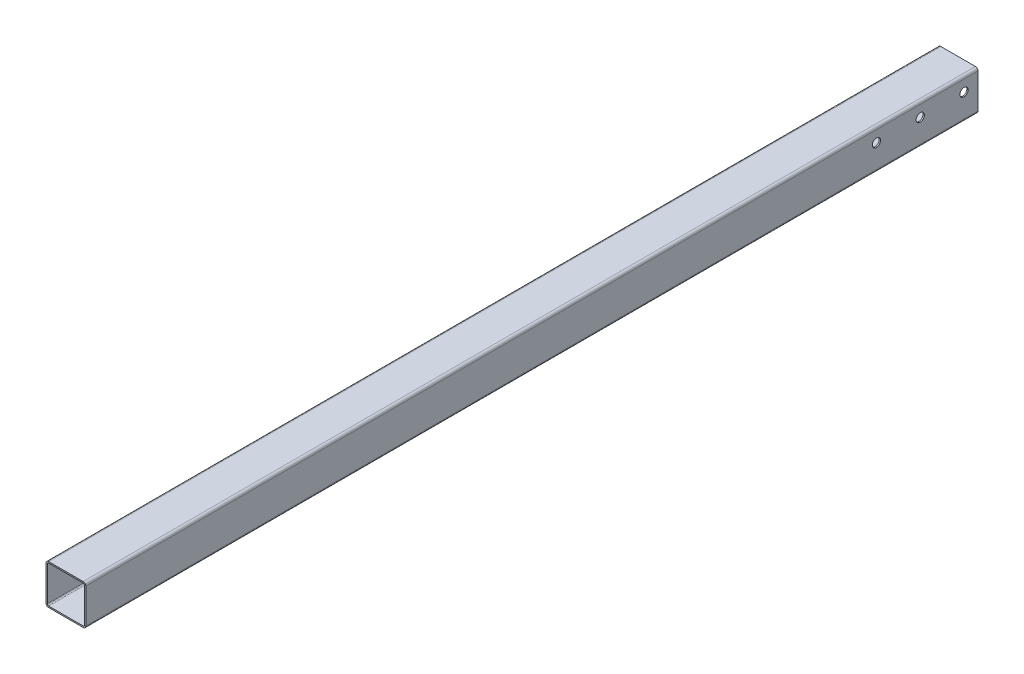
ISO-10303-21;
HEADER;
FILE_DESCRIPTION(('STEP AP214'),'2;1');
FILE_NAME('part.step','',(''),(''),'','','');
FILE_SCHEMA(('AUTOMOTIVE_DESIGN { 1 0 10303 214 1 1 1 1 }'));
ENDSEC;
DATA;
#1=APPLICATION_CONTEXT('core data for automotive mechanical design processes');
#2=APPLICATION_PROTOCOL_DEFINITION('international standard','automotive_design',2000,#1);
#3=PRODUCT_CONTEXT('',#1,'mechanical');
#4=PRODUCT('Part','Part','',(#3));
#5=PRODUCT_RELATED_PRODUCT_CATEGORY('part','',(#4));
#6=PRODUCT_DEFINITION_FORMATION('','',#4);
#7=PRODUCT_DEFINITION_CONTEXT('part definition',#1,'design');
#8=PRODUCT_DEFINITION('design','',#6,#7);
#9=PRODUCT_DEFINITION_SHAPE('','',#8);
#10=(LENGTH_UNIT() NAMED_UNIT(*) SI_UNIT(.MILLI.,.METRE.));
#11=(NAMED_UNIT(*) PLANE_ANGLE_UNIT() SI_UNIT($,.RADIAN.));
#12=(NAMED_UNIT(*) SI_UNIT($,.STERADIAN.) SOLID_ANGLE_UNIT());
#13=UNCERTAINTY_MEASURE_WITH_UNIT(LENGTH_MEASURE(1.E-05),#10,'distance_accuracy_value','');
#14=(GEOMETRIC_REPRESENTATION_CONTEXT(3) GLOBAL_UNCERTAINTY_ASSIGNED_CONTEXT((#13)) GLOBAL_UNIT_ASSIGNED_CONTEXT((#10,
#11,#12)) REPRESENTATION_CONTEXT('',''));
#15=CARTESIAN_POINT('',(0.,0.,0.));
#16=DIRECTION('',(0.,0.,1.));
#17=DIRECTION('',(1.,0.,0.));
#18=AXIS2_PLACEMENT_3D('',#15,#16,#17);
#19=CARTESIAN_POINT('',(-27.5336,-27.5336,1422.4));
#20=DIRECTION('',(0.,0.,-1.));
#21=DIRECTION('',(-1.,0.,0.));
#22=AXIS2_PLACEMENT_3D('',#19,#20,#21);
#23=PLANE('',#22);
#24=CARTESIAN_POINT('',(-27.5336,-27.5336,1422.4));
#25=DIRECTION('',(0.,0.,1.));
#26=DIRECTION('',(-1.,0.,0.));
#27=AXIS2_PLACEMENT_3D('',#24,#25,#26);
#28=CIRCLE('',#27,4.21639999999999);
#29=CARTESIAN_POINT('',(-31.75,-27.5336,1422.4));
#30=VERTEX_POINT('',#29);
#31=CARTESIAN_POINT('',(-27.5336,-31.75,1422.4));
#32=VERTEX_POINT('',#31);
#33=EDGE_CURVE('E229',#30,#32,#28,.T.);
#34=ORIENTED_EDGE('',*,*,#33,.T.);
#35=DIRECTION('',(1.,0.,0.));
#36=VECTOR('',#35,1.);
#37=CARTESIAN_POINT('',(27.5336,-31.75,1422.4));
#38=LINE('',#37,#36);
#39=CARTESIAN_POINT('',(27.5336,-31.75,1422.4));
#40=VERTEX_POINT('',#39);
#41=EDGE_CURVE('E232',#32,#40,#38,.T.);
#42=ORIENTED_EDGE('',*,*,#41,.T.);
#43=CARTESIAN_POINT('',(27.5336,-27.5336,1422.4));
#44=DIRECTION('',(0.,0.,1.));
#45=DIRECTION('',(-1.,0.,0.));
#46=AXIS2_PLACEMENT_3D('',#43,#44,#45);
#47=CIRCLE('',#46,4.21639999999999);
#48=CARTESIAN_POINT('',(31.75,-27.5336,1422.4));
#49=VERTEX_POINT('',#48);
#50=EDGE_CURVE('E235',#40,#49,#47,.T.);
#51=ORIENTED_EDGE('',*,*,#50,.T.);
#52=DIRECTION('',(0.,1.,0.));
#53=VECTOR('',#52,1.);
#54=CARTESIAN_POINT('',(31.75,27.5336,1422.4));
#55=LINE('',#54,#53);
#56=CARTESIAN_POINT('',(31.75,27.5336,1422.4));
#57=VERTEX_POINT('',#56);
#58=EDGE_CURVE('E237',#49,#57,#55,.T.);
#59=ORIENTED_EDGE('',*,*,#58,.T.);
#60=CARTESIAN_POINT('',(27.5336,27.5336,1422.4));
#61=DIRECTION('',(0.,0.,1.));
#62=DIRECTION('',(-1.,0.,0.));
#63=AXIS2_PLACEMENT_3D('',#60,#61,#62);
#64=CIRCLE('',#63,4.2164);
#65=CARTESIAN_POINT('',(27.5336,31.75,1422.4));
#66=VERTEX_POINT('',#65);
#67=EDGE_CURVE('E239',#57,#66,#64,.T.);
#68=ORIENTED_EDGE('',*,*,#67,.T.);
#69=DIRECTION('',(-1.,0.,0.));
#70=VECTOR('',#69,1.);
#71=CARTESIAN_POINT('',(27.5336,31.75,1422.4));
#72=LINE('',#71,#70);
#73=CARTESIAN_POINT('',(-27.5336,31.75,1422.4));
#74=VERTEX_POINT('',#73);
#75=EDGE_CURVE('E241',#66,#74,#72,.T.);
#76=ORIENTED_EDGE('',*,*,#75,.T.);
#77=CARTESIAN_POINT('',(-27.5336,27.5336,1422.4));
#78=DIRECTION('',(0.,0.,1.));
#79=DIRECTION('',(1.,0.,0.));
#80=AXIS2_PLACEMENT_3D('',#77,#78,#79);
#81=CIRCLE('',#80,4.2164);
#82=CARTESIAN_POINT('',(-31.75,27.5336,1422.4));
#83=VERTEX_POINT('',#82);
#84=EDGE_CURVE('E243',#74,#83,#81,.T.);
#85=ORIENTED_EDGE('',*,*,#84,.T.);
#86=DIRECTION('',(0.,-1.,0.));
#87=VECTOR('',#86,1.);
#88=CARTESIAN_POINT('',(-31.75,27.5336,1422.4));
#89=LINE('',#88,#87);
#90=EDGE_CURVE('E245',#83,#30,#89,.T.);
#91=ORIENTED_EDGE('',*,*,#90,.T.);
#92=EDGE_LOOP('',(#34,#42,#51,#59,#68,#76,#85,#91));
#93=FACE_BOUND('',#92,.T.);
#94=CARTESIAN_POINT('',(-27.5336,-27.5336,1422.4));
#95=DIRECTION('',(0.,0.,1.));
#96=DIRECTION('',(-1.,0.,0.));
#97=AXIS2_PLACEMENT_3D('',#94,#95,#96);
#98=CIRCLE('',#97,2.1082);
#99=CARTESIAN_POINT('',(-29.6418,-27.5336,1422.4));
#100=VERTEX_POINT('',#99);
#101=CARTESIAN_POINT('',(-27.5336,-29.6418,1422.4));
#102=VERTEX_POINT('',#101);
#103=EDGE_CURVE('E162',#100,#102,#98,.T.);
#104=ORIENTED_EDGE('',*,*,#103,.F.);
#105=DIRECTION('',(0.,-1.,0.));
#106=VECTOR('',#105,1.);
#107=CARTESIAN_POINT('',(-29.6418,27.5336,1422.4));
#108=LINE('',#107,#106);
#109=CARTESIAN_POINT('',(-29.6418,27.5336,1422.4));
#110=VERTEX_POINT('',#109);
#111=EDGE_CURVE('E196',#110,#100,#108,.T.);
#112=ORIENTED_EDGE('',*,*,#111,.F.);
#113=CARTESIAN_POINT('',(-27.5336,27.5336,1422.4));
#114=DIRECTION('',(0.,0.,1.));
#115=DIRECTION('',(1.,0.,0.));
#116=AXIS2_PLACEMENT_3D('',#113,#114,#115);
#117=CIRCLE('',#116,2.1082);
#118=CARTESIAN_POINT('',(-27.5336,29.6418,1422.4));
#119=VERTEX_POINT('',#118);
#120=EDGE_CURVE('E194',#119,#110,#117,.T.);
#121=ORIENTED_EDGE('',*,*,#120,.F.);
#122=DIRECTION('',(-1.,0.,0.));
#123=VECTOR('',#122,1.);
#124=CARTESIAN_POINT('',(27.5336,29.6418,1422.4));
#125=LINE('',#124,#123);
#126=CARTESIAN_POINT('',(27.5336,29.6418,1422.4));
#127=VERTEX_POINT('',#126);
#128=EDGE_CURVE('E192',#127,#119,#125,.T.);
#129=ORIENTED_EDGE('',*,*,#128,.F.);
#130=CARTESIAN_POINT('',(27.5336,27.5336,1422.4));
#131=DIRECTION('',(0.,0.,1.));
#132=DIRECTION('',(-1.,0.,0.));
#133=AXIS2_PLACEMENT_3D('',#130,#131,#132);
#134=CIRCLE('',#133,2.1082);
#135=CARTESIAN_POINT('',(29.6418,27.5336,1422.4));
#136=VERTEX_POINT('',#135);
#137=EDGE_CURVE('E190',#136,#127,#134,.T.);
#138=ORIENTED_EDGE('',*,*,#137,.F.);
#139=DIRECTION('',(0.,1.,0.));
#140=VECTOR('',#139,1.);
#141=CARTESIAN_POINT('',(29.6418,27.5336,1422.4));
#142=LINE('',#141,#140);
#143=CARTESIAN_POINT('',(29.6418,-27.5336,1422.4));
#144=VERTEX_POINT('',#143);
#145=EDGE_CURVE('E185',#144,#136,#142,.T.);
#146=ORIENTED_EDGE('',*,*,#145,.F.);
#147=CARTESIAN_POINT('',(27.5336,-27.5336,1422.4));
#148=DIRECTION('',(0.,0.,1.));
#149=DIRECTION('',(-1.,0.,0.));
#150=AXIS2_PLACEMENT_3D('',#147,#148,#149);
#151=CIRCLE('',#150,2.1082);
#152=CARTESIAN_POINT('',(27.5336,-29.6418,1422.4));
#153=VERTEX_POINT('',#152);
#154=EDGE_CURVE('E183',#153,#144,#151,.T.);
#155=ORIENTED_EDGE('',*,*,#154,.F.);
#156=DIRECTION('',(1.,0.,0.));
#157=VECTOR('',#156,1.);
#158=CARTESIAN_POINT('',(27.5336,-29.6418,1422.4));
#159=LINE('',#158,#157);
#160=EDGE_CURVE('E170',#102,#153,#159,.T.);
#161=ORIENTED_EDGE('',*,*,#160,.F.);
#162=EDGE_LOOP('',(#104,#112,#121,#129,#138,#146,#155,#161));
#163=FACE_BOUND('',#162,.T.);
#164=ADVANCED_FACE('F47',(#93,#163),#23,.F.);
#165=CARTESIAN_POINT('',(-27.5336,-27.5336,0.));
#166=DIRECTION('',(0.,0.,-1.));
#167=DIRECTION('',(-1.,0.,0.));
#168=AXIS2_PLACEMENT_3D('',#165,#166,#167);
#169=PLANE('',#168);
#170=CARTESIAN_POINT('',(-27.5336,-27.5336,0.));
#171=DIRECTION('',(0.,0.,1.));
#172=DIRECTION('',(-1.,0.,0.));
#173=AXIS2_PLACEMENT_3D('',#170,#171,#172);
#174=CIRCLE('',#173,4.21639999999999);
#175=CARTESIAN_POINT('',(-31.75,-27.5336,0.));
#176=VERTEX_POINT('',#175);
#177=CARTESIAN_POINT('',(-27.5336,-31.75,0.));
#178=VERTEX_POINT('',#177);
#179=EDGE_CURVE('E178',#176,#178,#174,.T.);
#180=ORIENTED_EDGE('',*,*,#179,.F.);
#181=DIRECTION('',(0.,-1.,0.));
#182=VECTOR('',#181,1.);
#183=CARTESIAN_POINT('',(-31.75,27.5336,0.));
#184=LINE('',#183,#182);
#185=CARTESIAN_POINT('',(-31.75,27.5336,0.));
#186=VERTEX_POINT('',#185);
#187=EDGE_CURVE('E233',#186,#176,#184,.T.);
#188=ORIENTED_EDGE('',*,*,#187,.F.);
#189=CARTESIAN_POINT('',(-27.5336,27.5336,0.));
#190=DIRECTION('',(0.,0.,1.));
#191=DIRECTION('',(1.,0.,0.));
#192=AXIS2_PLACEMENT_3D('',#189,#190,#191);
#193=CIRCLE('',#192,4.2164);
#194=CARTESIAN_POINT('',(-27.5336,31.75,0.));
#195=VERTEX_POINT('',#194);
#196=EDGE_CURVE('E260',#195,#186,#193,.T.);
#197=ORIENTED_EDGE('',*,*,#196,.F.);
#198=DIRECTION('',(-1.,0.,0.));
#199=VECTOR('',#198,1.);
#200=CARTESIAN_POINT('',(27.5336,31.75,0.));
#201=LINE('',#200,#199);
#202=CARTESIAN_POINT('',(27.5336,31.75,0.));
#203=VERTEX_POINT('',#202);
#204=EDGE_CURVE('E258',#203,#195,#201,.T.);
#205=ORIENTED_EDGE('',*,*,#204,.F.);
#206=CARTESIAN_POINT('',(27.5336,27.5336,0.));
#207=DIRECTION('',(0.,0.,1.));
#208=DIRECTION('',(-1.,0.,0.));
#209=AXIS2_PLACEMENT_3D('',#206,#207,#208);
#210=CIRCLE('',#209,4.2164);
#211=CARTESIAN_POINT('',(31.75,27.5336,0.));
#212=VERTEX_POINT('',#211);
#213=EDGE_CURVE('E256',#212,#203,#210,.T.);
#214=ORIENTED_EDGE('',*,*,#213,.F.);
#215=DIRECTION('',(0.,1.,0.));
#216=VECTOR('',#215,1.);
#217=CARTESIAN_POINT('',(31.75,27.5336,0.));
#218=LINE('',#217,#216);
#219=CARTESIAN_POINT('',(31.75,-27.5336,0.));
#220=VERTEX_POINT('',#219);
#221=EDGE_CURVE('E254',#220,#212,#218,.T.);
#222=ORIENTED_EDGE('',*,*,#221,.F.);
#223=CARTESIAN_POINT('',(27.5336,-27.5336,0.));
#224=DIRECTION('',(0.,0.,1.));
#225=DIRECTION('',(-1.,0.,0.));
#226=AXIS2_PLACEMENT_3D('',#223,#224,#225);
#227=CIRCLE('',#226,4.21639999999999);
#228=CARTESIAN_POINT('',(27.5336,-31.75,0.));
#229=VERTEX_POINT('',#228);
#230=EDGE_CURVE('E252',#229,#220,#227,.T.);
#231=ORIENTED_EDGE('',*,*,#230,.F.);
#232=DIRECTION('',(1.,0.,0.));
#233=VECTOR('',#232,1.);
#234=CARTESIAN_POINT('',(27.5336,-31.75,0.));
#235=LINE('',#234,#233);
#236=EDGE_CURVE('E250',#178,#229,#235,.T.);
#237=ORIENTED_EDGE('',*,*,#236,.F.);
#238=EDGE_LOOP('',(#180,#188,#197,#205,#214,#222,#231,#237));
#239=FACE_BOUND('',#238,.T.);
#240=DIRECTION('',(0.,-1.,0.));
#241=VECTOR('',#240,1.);
#242=CARTESIAN_POINT('',(-29.6418,27.5336,0.));
#243=LINE('',#242,#241);
#244=CARTESIAN_POINT('',(-29.6418,27.5336,0.));
#245=VERTEX_POINT('',#244);
#246=CARTESIAN_POINT('',(-29.6418,-27.5336,0.));
#247=VERTEX_POINT('',#246);
#248=EDGE_CURVE('E171',#245,#247,#243,.T.);
#249=ORIENTED_EDGE('',*,*,#248,.T.);
#250=CARTESIAN_POINT('',(-27.5336,-27.5336,0.));
#251=DIRECTION('',(0.,0.,1.));
#252=DIRECTION('',(-1.,0.,0.));
#253=AXIS2_PLACEMENT_3D('',#250,#251,#252);
#254=CIRCLE('',#253,2.1082);
#255=CARTESIAN_POINT('',(-27.5336,-29.6418,0.));
#256=VERTEX_POINT('',#255);
#257=EDGE_CURVE('E72',#247,#256,#254,.T.);
#258=ORIENTED_EDGE('',*,*,#257,.T.);
#259=DIRECTION('',(1.,0.,0.));
#260=VECTOR('',#259,1.);
#261=CARTESIAN_POINT('',(27.5336,-29.6418,0.));
#262=LINE('',#261,#260);
#263=CARTESIAN_POINT('',(27.5336,-29.6418,0.));
#264=VERTEX_POINT('',#263);
#265=EDGE_CURVE('E177',#256,#264,#262,.T.);
#266=ORIENTED_EDGE('',*,*,#265,.T.);
#267=CARTESIAN_POINT('',(27.5336,-27.5336,0.));
#268=DIRECTION('',(0.,0.,1.));
#269=DIRECTION('',(-1.,0.,0.));
#270=AXIS2_PLACEMENT_3D('',#267,#268,#269);
#271=CIRCLE('',#270,2.1082);
#272=CARTESIAN_POINT('',(29.6418,-27.5336,0.));
#273=VERTEX_POINT('',#272);
#274=EDGE_CURVE('E201',#264,#273,#271,.T.);
#275=ORIENTED_EDGE('',*,*,#274,.T.);
#276=DIRECTION('',(0.,1.,0.));
#277=VECTOR('',#276,1.);
#278=CARTESIAN_POINT('',(29.6418,27.5336,0.));
#279=LINE('',#278,#277);
#280=CARTESIAN_POINT('',(29.6418,27.5336,0.));
#281=VERTEX_POINT('',#280);
#282=EDGE_CURVE('E204',#273,#281,#279,.T.);
#283=ORIENTED_EDGE('',*,*,#282,.T.);
#284=CARTESIAN_POINT('',(27.5336,27.5336,0.));
#285=DIRECTION('',(0.,0.,1.));
#286=DIRECTION('',(-1.,0.,0.));
#287=AXIS2_PLACEMENT_3D('',#284,#285,#286);
#288=CIRCLE('',#287,2.1082);
#289=CARTESIAN_POINT('',(27.5336,29.6418,0.));
#290=VERTEX_POINT('',#289);
#291=EDGE_CURVE('E207',#281,#290,#288,.T.);
#292=ORIENTED_EDGE('',*,*,#291,.T.);
#293=DIRECTION('',(-1.,0.,0.));
#294=VECTOR('',#293,1.);
#295=CARTESIAN_POINT('',(27.5336,29.6418,0.));
#296=LINE('',#295,#294);
#297=CARTESIAN_POINT('',(-27.5336,29.6418,0.));
#298=VERTEX_POINT('',#297);
#299=EDGE_CURVE('E210',#290,#298,#296,.T.);
#300=ORIENTED_EDGE('',*,*,#299,.T.);
#301=CARTESIAN_POINT('',(-27.5336,27.5336,0.));
#302=DIRECTION('',(0.,0.,1.));
#303=DIRECTION('',(1.,0.,0.));
#304=AXIS2_PLACEMENT_3D('',#301,#302,#303);
#305=CIRCLE('',#304,2.1082);
#306=EDGE_CURVE('E213',#298,#245,#305,.T.);
#307=ORIENTED_EDGE('',*,*,#306,.T.);
#308=EDGE_LOOP('',(#249,#258,#266,#275,#283,#292,#300,#307));
#309=FACE_BOUND('',#308,.T.);
#310=ADVANCED_FACE('F326',(#239,#309),#169,.T.);
#311=CARTESIAN_POINT('',(-27.5336,-27.5336,1422.4));
#312=DIRECTION('',(0.,0.,-1.));
#313=DIRECTION('',(-1.,0.,0.));
#314=AXIS2_PLACEMENT_3D('',#311,#312,#313);
#315=CYLINDRICAL_SURFACE('',#314,4.21639999999999);
#316=ORIENTED_EDGE('',*,*,#179,.T.);
#317=DIRECTION('',(0.,0.,-1.));
#318=VECTOR('',#317,1.);
#319=CARTESIAN_POINT('',(-27.5336,-31.75,1422.4));
#320=LINE('',#319,#318);
#321=EDGE_CURVE('E11',#32,#178,#320,.T.);
#322=ORIENTED_EDGE('',*,*,#321,.F.);
#323=ORIENTED_EDGE('',*,*,#33,.F.);
#324=DIRECTION('',(0.,0.,-1.));
#325=VECTOR('',#324,1.);
#326=CARTESIAN_POINT('',(-31.75,-27.5336,1422.4));
#327=LINE('',#326,#325);
#328=EDGE_CURVE('E247',#30,#176,#327,.T.);
#329=ORIENTED_EDGE('',*,*,#328,.T.);
#330=EDGE_LOOP('',(#316,#322,#323,#329));
#331=FACE_BOUND('',#330,.T.);
#332=ADVANCED_FACE('F49',(#331),#315,.T.);
#333=CARTESIAN_POINT('',(27.5336,-31.75,1422.4));
#334=DIRECTION('',(0.,1.,0.));
#335=DIRECTION('',(0.,0.,1.));
#336=AXIS2_PLACEMENT_3D('',#333,#334,#335);
#337=PLANE('',#336);
#338=ORIENTED_EDGE('',*,*,#236,.T.);
#339=DIRECTION('',(0.,0.,-1.));
#340=VECTOR('',#339,1.);
#341=CARTESIAN_POINT('',(27.5336,-31.75,1422.4));
#342=LINE('',#341,#340);
#343=EDGE_CURVE('E56',#40,#229,#342,.T.);
#344=ORIENTED_EDGE('',*,*,#343,.F.);
#345=ORIENTED_EDGE('',*,*,#41,.F.);
#346=ORIENTED_EDGE('',*,*,#321,.T.);
#347=EDGE_LOOP('',(#338,#344,#345,#346));
#348=FACE_BOUND('',#347,.T.);
#349=ADVANCED_FACE('F366',(#348),#337,.F.);
#350=CARTESIAN_POINT('',(27.5336,-27.5336,1422.4));
#351=DIRECTION('',(0.,0.,-1.));
#352=DIRECTION('',(-1.,0.,0.));
#353=AXIS2_PLACEMENT_3D('',#350,#351,#352);
#354=CYLINDRICAL_SURFACE('',#353,4.21639999999999);
#355=ORIENTED_EDGE('',*,*,#230,.T.);
#356=DIRECTION('',(0.,0.,-1.));
#357=VECTOR('',#356,1.);
#358=CARTESIAN_POINT('',(31.75,-27.5336,1422.4));
#359=LINE('',#358,#357);
#360=EDGE_CURVE('E277',#49,#220,#359,.T.);
#361=ORIENTED_EDGE('',*,*,#360,.F.);
#362=ORIENTED_EDGE('',*,*,#50,.F.);
#363=ORIENTED_EDGE('',*,*,#343,.T.);
#364=EDGE_LOOP('',(#355,#361,#362,#363));
#365=FACE_BOUND('',#364,.T.);
#366=ADVANCED_FACE('F363',(#365),#354,.T.);
#367=CARTESIAN_POINT('',(31.75,27.5336,1422.4));
#368=DIRECTION('',(-1.,0.,0.));
#369=DIRECTION('',(0.,0.,1.));
#370=AXIS2_PLACEMENT_3D('',#367,#368,#369);
#371=PLANE('',#370);
#372=CARTESIAN_POINT('',(31.75,9.52499999999999,22.225));
#373=DIRECTION('',(1.,0.,0.));
#374=DIRECTION('',(0.,0.,-1.));
#375=AXIS2_PLACEMENT_3D('',#372,#373,#374);
#376=CIRCLE('',#375,6.54811999999999);
#377=CARTESIAN_POINT('',(31.75,9.52499999999999,15.67688));
#378=VERTEX_POINT('',#377);
#379=EDGE_CURVE('E620',#378,#378,#376,.T.);
#380=ORIENTED_EDGE('',*,*,#379,.F.);
#381=EDGE_LOOP('',(#380));
#382=FACE_BOUND('',#381,.T.);
#383=CARTESIAN_POINT('',(31.75,9.525,92.075));
#384=DIRECTION('',(1.,0.,0.));
#385=DIRECTION('',(0.,0.,-1.));
#386=AXIS2_PLACEMENT_3D('',#383,#384,#385);
#387=CIRCLE('',#386,6.54811999999999);
#388=CARTESIAN_POINT('',(31.75,9.525,85.52688));
#389=VERTEX_POINT('',#388);
#390=EDGE_CURVE('E295',#389,#389,#387,.T.);
#391=ORIENTED_EDGE('',*,*,#390,.F.);
#392=EDGE_LOOP('',(#391));
#393=FACE_BOUND('',#392,.T.);
#394=CARTESIAN_POINT('',(31.75,9.525,161.925));
#395=DIRECTION('',(1.,0.,0.));
#396=DIRECTION('',(0.,0.,-1.));
#397=AXIS2_PLACEMENT_3D('',#394,#395,#396);
#398=CIRCLE('',#397,6.54811999999999);
#399=CARTESIAN_POINT('',(31.75,9.525,155.37688));
#400=VERTEX_POINT('',#399);
#401=EDGE_CURVE('E292',#400,#400,#398,.T.);
#402=ORIENTED_EDGE('',*,*,#401,.F.);
#403=EDGE_LOOP('',(#402));
#404=FACE_BOUND('',#403,.T.);
#405=ORIENTED_EDGE('',*,*,#221,.T.);
#406=DIRECTION('',(0.,0.,-1.));
#407=VECTOR('',#406,1.);
#408=CARTESIAN_POINT('',(31.75,27.5336,1422.4));
#409=LINE('',#408,#407);
#410=EDGE_CURVE('E274',#57,#212,#409,.T.);
#411=ORIENTED_EDGE('',*,*,#410,.F.);
#412=ORIENTED_EDGE('',*,*,#58,.F.);
#413=ORIENTED_EDGE('',*,*,#360,.T.);
#414=EDGE_LOOP('',(#405,#411,#412,#413));
#415=FACE_BOUND('',#414,.T.);
#416=ADVANCED_FACE('F359',(#382,#393,#404,#415),#371,.F.);
#417=CARTESIAN_POINT('',(27.5336,27.5336,1422.4));
#418=DIRECTION('',(0.,0.,-1.));
#419=DIRECTION('',(-1.,0.,0.));
#420=AXIS2_PLACEMENT_3D('',#417,#418,#419);
#421=CYLINDRICAL_SURFACE('',#420,4.2164);
#422=ORIENTED_EDGE('',*,*,#213,.T.);
#423=DIRECTION('',(0.,0.,-1.));
#424=VECTOR('',#423,1.);
#425=CARTESIAN_POINT('',(27.5336,31.75,1422.4));
#426=LINE('',#425,#424);
#427=EDGE_CURVE('E271',#66,#203,#426,.T.);
#428=ORIENTED_EDGE('',*,*,#427,.F.);
#429=ORIENTED_EDGE('',*,*,#67,.F.);
#430=ORIENTED_EDGE('',*,*,#410,.T.);
#431=EDGE_LOOP('',(#422,#428,#429,#430));
#432=FACE_BOUND('',#431,.T.);
#433=ADVANCED_FACE('F355',(#432),#421,.T.);
#434=CARTESIAN_POINT('',(27.5336,31.75,1422.4));
#435=DIRECTION('',(0.,-1.,0.));
#436=DIRECTION('',(0.,0.,-1.));
#437=AXIS2_PLACEMENT_3D('',#434,#435,#436);
#438=PLANE('',#437);
#439=ORIENTED_EDGE('',*,*,#204,.T.);
#440=DIRECTION('',(0.,0.,-1.));
#441=VECTOR('',#440,1.);
#442=CARTESIAN_POINT('',(-27.5336,31.75,1422.4));
#443=LINE('',#442,#441);
#444=EDGE_CURVE('E268',#74,#195,#443,.T.);
#445=ORIENTED_EDGE('',*,*,#444,.F.);
#446=ORIENTED_EDGE('',*,*,#75,.F.);
#447=ORIENTED_EDGE('',*,*,#427,.T.);
#448=EDGE_LOOP('',(#439,#445,#446,#447));
#449=FACE_BOUND('',#448,.T.);
#450=ADVANCED_FACE('F351',(#449),#438,.F.);
#451=CARTESIAN_POINT('',(-27.5336,27.5336,1422.4));
#452=DIRECTION('',(0.,0.,-1.));
#453=DIRECTION('',(-1.,0.,0.));
#454=AXIS2_PLACEMENT_3D('',#451,#452,#453);
#455=CYLINDRICAL_SURFACE('',#454,4.2164);
#456=ORIENTED_EDGE('',*,*,#196,.T.);
#457=DIRECTION('',(0.,0.,-1.));
#458=VECTOR('',#457,1.);
#459=CARTESIAN_POINT('',(-31.75,27.5336,1422.4));
#460=LINE('',#459,#458);
#461=EDGE_CURVE('E265',#83,#186,#460,.T.);
#462=ORIENTED_EDGE('',*,*,#461,.F.);
#463=ORIENTED_EDGE('',*,*,#84,.F.);
#464=ORIENTED_EDGE('',*,*,#444,.T.);
#465=EDGE_LOOP('',(#456,#462,#463,#464));
#466=FACE_BOUND('',#465,.T.);
#467=ADVANCED_FACE('F347',(#466),#455,.T.);
#468=CARTESIAN_POINT('',(-31.75,27.5336,1422.4));
#469=DIRECTION('',(1.,0.,0.));
#470=DIRECTION('',(0.,1.,0.));
#471=AXIS2_PLACEMENT_3D('',#468,#469,#470);
#472=PLANE('',#471);
#473=CARTESIAN_POINT('',(-31.75,9.52499999999999,22.225));
#474=DIRECTION('',(1.,0.,0.));
#475=DIRECTION('',(0.,0.,-1.));
#476=AXIS2_PLACEMENT_3D('',#473,#474,#475);
#477=CIRCLE('',#476,6.54811999999998);
#478=CARTESIAN_POINT('',(-31.75,9.52499999999999,15.67688));
#479=VERTEX_POINT('',#478);
#480=EDGE_CURVE('E621',#479,#479,#477,.T.);
#481=ORIENTED_EDGE('',*,*,#480,.T.);
#482=EDGE_LOOP('',(#481));
#483=FACE_BOUND('',#482,.T.);
#484=CARTESIAN_POINT('',(-31.75,9.525,92.075));
#485=DIRECTION('',(1.,0.,0.));
#486=DIRECTION('',(0.,0.,-1.));
#487=AXIS2_PLACEMENT_3D('',#484,#485,#486);
#488=CIRCLE('',#487,6.54811999999998);
#489=CARTESIAN_POINT('',(-31.75,9.525,85.52688));
#490=VERTEX_POINT('',#489);
#491=EDGE_CURVE('E288',#490,#490,#488,.T.);
#492=ORIENTED_EDGE('',*,*,#491,.T.);
#493=EDGE_LOOP('',(#492));
#494=FACE_BOUND('',#493,.T.);
#495=CARTESIAN_POINT('',(-31.75,9.525,161.925));
#496=DIRECTION('',(1.,0.,0.));
#497=DIRECTION('',(0.,0.,-1.));
#498=AXIS2_PLACEMENT_3D('',#495,#496,#497);
#499=CIRCLE('',#498,6.54811999999998);
#500=CARTESIAN_POINT('',(-31.75,9.525,155.37688));
#501=VERTEX_POINT('',#500);
#502=EDGE_CURVE('E284',#501,#501,#499,.T.);
#503=ORIENTED_EDGE('',*,*,#502,.T.);
#504=EDGE_LOOP('',(#503));
#505=FACE_BOUND('',#504,.T.);
#506=ORIENTED_EDGE('',*,*,#187,.T.);
#507=ORIENTED_EDGE('',*,*,#328,.F.);
#508=ORIENTED_EDGE('',*,*,#90,.F.);
#509=ORIENTED_EDGE('',*,*,#461,.T.);
#510=EDGE_LOOP('',(#506,#507,#508,#509));
#511=FACE_BOUND('',#510,.T.);
#512=ADVANCED_FACE('F344',(#483,#494,#505,#511),#472,.F.);
#513=CARTESIAN_POINT('',(-27.5336,-27.5336,1422.4));
#514=DIRECTION('',(0.,0.,-1.));
#515=DIRECTION('',(-1.,0.,0.));
#516=AXIS2_PLACEMENT_3D('',#513,#514,#515);
#517=CYLINDRICAL_SURFACE('',#516,2.1082);
#518=ORIENTED_EDGE('',*,*,#257,.F.);
#519=DIRECTION('',(0.,0.,-1.));
#520=VECTOR('',#519,1.);
#521=CARTESIAN_POINT('',(-29.6418,-27.5336,1422.4));
#522=LINE('',#521,#520);
#523=EDGE_CURVE('E166',#100,#247,#522,.T.);
#524=ORIENTED_EDGE('',*,*,#523,.F.);
#525=ORIENTED_EDGE('',*,*,#103,.T.);
#526=DIRECTION('',(0.,0.,-1.));
#527=VECTOR('',#526,1.);
#528=CARTESIAN_POINT('',(-27.5336,-29.6418,1422.4));
#529=LINE('',#528,#527);
#530=EDGE_CURVE('E165',#102,#256,#529,.T.);
#531=ORIENTED_EDGE('',*,*,#530,.T.);
#532=EDGE_LOOP('',(#518,#524,#525,#531));
#533=FACE_BOUND('',#532,.T.);
#534=ADVANCED_FACE('F164',(#533),#517,.F.);
#535=CARTESIAN_POINT('',(27.5336,-29.6418,1422.4));
#536=DIRECTION('',(0.,1.,0.));
#537=DIRECTION('',(0.,0.,1.));
#538=AXIS2_PLACEMENT_3D('',#535,#536,#537);
#539=PLANE('',#538);
#540=ORIENTED_EDGE('',*,*,#265,.F.);
#541=ORIENTED_EDGE('',*,*,#530,.F.);
#542=ORIENTED_EDGE('',*,*,#160,.T.);
#543=DIRECTION('',(0.,0.,-1.));
#544=VECTOR('',#543,1.);
#545=CARTESIAN_POINT('',(27.5336,-29.6418,1422.4));
#546=LINE('',#545,#544);
#547=EDGE_CURVE('E179',#153,#264,#546,.T.);
#548=ORIENTED_EDGE('',*,*,#547,.T.);
#549=EDGE_LOOP('',(#540,#541,#542,#548));
#550=FACE_BOUND('',#549,.T.);
#551=ADVANCED_FACE('F174',(#550),#539,.T.);
#552=CARTESIAN_POINT('',(27.5336,-27.5336,1422.4));
#553=DIRECTION('',(0.,0.,-1.));
#554=DIRECTION('',(-1.,0.,0.));
#555=AXIS2_PLACEMENT_3D('',#552,#553,#554);
#556=CYLINDRICAL_SURFACE('',#555,2.1082);
#557=ORIENTED_EDGE('',*,*,#274,.F.);
#558=ORIENTED_EDGE('',*,*,#547,.F.);
#559=ORIENTED_EDGE('',*,*,#154,.T.);
#560=DIRECTION('',(0.,0.,-1.));
#561=VECTOR('',#560,1.);
#562=CARTESIAN_POINT('',(29.6418,-27.5336,1422.4));
#563=LINE('',#562,#561);
#564=EDGE_CURVE('E226',#144,#273,#563,.T.);
#565=ORIENTED_EDGE('',*,*,#564,.T.);
#566=EDGE_LOOP('',(#557,#558,#559,#565));
#567=FACE_BOUND('',#566,.T.);
#568=ADVANCED_FACE('F317',(#567),#556,.F.);
#569=CARTESIAN_POINT('',(29.6418,27.5336,1422.4));
#570=DIRECTION('',(-1.,0.,0.));
#571=DIRECTION('',(0.,0.,1.));
#572=AXIS2_PLACEMENT_3D('',#569,#570,#571);
#573=PLANE('',#572);
#574=CARTESIAN_POINT('',(29.6418,9.52499999999999,22.225));
#575=DIRECTION('',(-1.,0.,0.));
#576=DIRECTION('',(0.,0.,1.));
#577=AXIS2_PLACEMENT_3D('',#574,#575,#576);
#578=CIRCLE('',#577,6.54811999999999);
#579=CARTESIAN_POINT('',(29.6418,9.52499999999999,28.77312));
#580=VERTEX_POINT('',#579);
#581=EDGE_CURVE('E300',#580,#580,#578,.T.);
#582=ORIENTED_EDGE('',*,*,#581,.F.);
#583=EDGE_LOOP('',(#582));
#584=FACE_BOUND('',#583,.T.);
#585=CARTESIAN_POINT('',(29.6418,9.525,92.075));
#586=DIRECTION('',(-1.,0.,0.));
#587=DIRECTION('',(0.,0.,1.));
#588=AXIS2_PLACEMENT_3D('',#585,#586,#587);
#589=CIRCLE('',#588,6.54811999999999);
#590=CARTESIAN_POINT('',(29.6418,9.525,98.62312));
#591=VERTEX_POINT('',#590);
#592=EDGE_CURVE('E287',#591,#591,#589,.T.);
#593=ORIENTED_EDGE('',*,*,#592,.F.);
#594=EDGE_LOOP('',(#593));
#595=FACE_BOUND('',#594,.T.);
#596=CARTESIAN_POINT('',(29.6418,9.525,161.925));
#597=DIRECTION('',(-1.,0.,0.));
#598=DIRECTION('',(0.,0.,1.));
#599=AXIS2_PLACEMENT_3D('',#596,#597,#598);
#600=CIRCLE('',#599,6.54811999999999);
#601=CARTESIAN_POINT('',(29.6418,9.525,168.47312));
#602=VERTEX_POINT('',#601);
#603=EDGE_CURVE('E199',#602,#602,#600,.T.);
#604=ORIENTED_EDGE('',*,*,#603,.F.);
#605=EDGE_LOOP('',(#604));
#606=FACE_BOUND('',#605,.T.);
#607=ORIENTED_EDGE('',*,*,#282,.F.);
#608=ORIENTED_EDGE('',*,*,#564,.F.);
#609=ORIENTED_EDGE('',*,*,#145,.T.);
#610=DIRECTION('',(0.,0.,-1.));
#611=VECTOR('',#610,1.);
#612=CARTESIAN_POINT('',(29.6418,27.5336,1422.4));
#613=LINE('',#612,#611);
#614=EDGE_CURVE('E224',#136,#281,#613,.T.);
#615=ORIENTED_EDGE('',*,*,#614,.T.);
#616=EDGE_LOOP('',(#607,#608,#609,#615));
#617=FACE_BOUND('',#616,.T.);
#618=ADVANCED_FACE('F313',(#584,#595,#606,#617),#573,.T.);
#619=CARTESIAN_POINT('',(27.5336,27.5336,1422.4));
#620=DIRECTION('',(0.,0.,-1.));
#621=DIRECTION('',(-1.,0.,0.));
#622=AXIS2_PLACEMENT_3D('',#619,#620,#621);
#623=CYLINDRICAL_SURFACE('',#622,2.1082);
#624=ORIENTED_EDGE('',*,*,#291,.F.);
#625=ORIENTED_EDGE('',*,*,#614,.F.);
#626=ORIENTED_EDGE('',*,*,#137,.T.);
#627=DIRECTION('',(0.,0.,-1.));
#628=VECTOR('',#627,1.);
#629=CARTESIAN_POINT('',(27.5336,29.6418,1422.4));
#630=LINE('',#629,#628);
#631=EDGE_CURVE('E222',#127,#290,#630,.T.);
#632=ORIENTED_EDGE('',*,*,#631,.T.);
#633=EDGE_LOOP('',(#624,#625,#626,#632));
#634=FACE_BOUND('',#633,.T.);
#635=ADVANCED_FACE('F316',(#634),#623,.F.);
#636=CARTESIAN_POINT('',(27.5336,29.6418,1422.4));
#637=DIRECTION('',(0.,-1.,0.));
#638=DIRECTION('',(1.,0.,0.));
#639=AXIS2_PLACEMENT_3D('',#636,#637,#638);
#640=PLANE('',#639);
#641=ORIENTED_EDGE('',*,*,#299,.F.);
#642=ORIENTED_EDGE('',*,*,#631,.F.);
#643=ORIENTED_EDGE('',*,*,#128,.T.);
#644=DIRECTION('',(0.,0.,-1.));
#645=VECTOR('',#644,1.);
#646=CARTESIAN_POINT('',(-27.5336,29.6418,1422.4));
#647=LINE('',#646,#645);
#648=EDGE_CURVE('E220',#119,#298,#647,.T.);
#649=ORIENTED_EDGE('',*,*,#648,.T.);
#650=EDGE_LOOP('',(#641,#642,#643,#649));
#651=FACE_BOUND('',#650,.T.);
#652=ADVANCED_FACE('F523',(#651),#640,.T.);
#653=CARTESIAN_POINT('',(-27.5336,27.5336,1422.4));
#654=DIRECTION('',(0.,0.,-1.));
#655=DIRECTION('',(-1.,0.,0.));
#656=AXIS2_PLACEMENT_3D('',#653,#654,#655);
#657=CYLINDRICAL_SURFACE('',#656,2.1082);
#658=ORIENTED_EDGE('',*,*,#306,.F.);
#659=ORIENTED_EDGE('',*,*,#648,.F.);
#660=ORIENTED_EDGE('',*,*,#120,.T.);
#661=DIRECTION('',(0.,0.,-1.));
#662=VECTOR('',#661,1.);
#663=CARTESIAN_POINT('',(-29.6418,27.5336,1422.4));
#664=LINE('',#663,#662);
#665=EDGE_CURVE('E64',#110,#245,#664,.T.);
#666=ORIENTED_EDGE('',*,*,#665,.T.);
#667=EDGE_LOOP('',(#658,#659,#660,#666));
#668=FACE_BOUND('',#667,.T.);
#669=ADVANCED_FACE('F535',(#668),#657,.F.);
#670=CARTESIAN_POINT('',(-29.6418,27.5336,1422.4));
#671=DIRECTION('',(1.,0.,0.));
#672=DIRECTION('',(0.,0.,-1.));
#673=AXIS2_PLACEMENT_3D('',#670,#671,#672);
#674=PLANE('',#673);
#675=CARTESIAN_POINT('',(-29.6418,9.52499999999999,22.225));
#676=DIRECTION('',(1.,0.,0.));
#677=DIRECTION('',(0.,0.,-1.));
#678=AXIS2_PLACEMENT_3D('',#675,#676,#677);
#679=CIRCLE('',#678,6.54811999999999);
#680=CARTESIAN_POINT('',(-29.6418,9.52499999999999,15.67688));
#681=VERTEX_POINT('',#680);
#682=EDGE_CURVE('E51',#681,#681,#679,.T.);
#683=ORIENTED_EDGE('',*,*,#682,.F.);
#684=EDGE_LOOP('',(#683));
#685=FACE_BOUND('',#684,.T.);
#686=CARTESIAN_POINT('',(-29.6418,9.525,92.075));
#687=DIRECTION('',(1.,0.,0.));
#688=DIRECTION('',(0.,0.,-1.));
#689=AXIS2_PLACEMENT_3D('',#686,#687,#688);
#690=CIRCLE('',#689,6.54811999999999);
#691=CARTESIAN_POINT('',(-29.6418,9.525,85.52688));
#692=VERTEX_POINT('',#691);
#693=EDGE_CURVE('E285',#692,#692,#690,.T.);
#694=ORIENTED_EDGE('',*,*,#693,.F.);
#695=EDGE_LOOP('',(#694));
#696=FACE_BOUND('',#695,.T.);
#697=CARTESIAN_POINT('',(-29.6418,9.525,161.925));
#698=DIRECTION('',(1.,0.,0.));
#699=DIRECTION('',(0.,0.,-1.));
#700=AXIS2_PLACEMENT_3D('',#697,#698,#699);
#701=CIRCLE('',#700,6.54811999999999);
#702=CARTESIAN_POINT('',(-29.6418,9.525,155.37688));
#703=VERTEX_POINT('',#702);
#704=EDGE_CURVE('E282',#703,#703,#701,.T.);
#705=ORIENTED_EDGE('',*,*,#704,.F.);
#706=EDGE_LOOP('',(#705));
#707=FACE_BOUND('',#706,.T.);
#708=ORIENTED_EDGE('',*,*,#248,.F.);
#709=ORIENTED_EDGE('',*,*,#665,.F.);
#710=ORIENTED_EDGE('',*,*,#111,.T.);
#711=ORIENTED_EDGE('',*,*,#523,.T.);
#712=EDGE_LOOP('',(#708,#709,#710,#711));
#713=FACE_BOUND('',#712,.T.);
#714=ADVANCED_FACE('F546',(#685,#696,#707,#713),#674,.T.);
#715=CARTESIAN_POINT('',(31.75,9.525,161.925));
#716=DIRECTION('',(1.,0.,0.));
#717=DIRECTION('',(0.,0.,-1.));
#718=AXIS2_PLACEMENT_3D('',#715,#716,#717);
#719=CYLINDRICAL_SURFACE('',#718,6.54811999999999);
#720=ORIENTED_EDGE('',*,*,#704,.T.);
#721=EDGE_LOOP('',(#720));
#722=FACE_BOUND('',#721,.T.);
#723=ORIENTED_EDGE('',*,*,#502,.F.);
#724=EDGE_LOOP('',(#723));
#725=FACE_BOUND('',#724,.T.);
#726=ADVANCED_FACE('F557',(#722,#725),#719,.F.);
#727=ORIENTED_EDGE('',*,*,#603,.T.);
#728=EDGE_LOOP('',(#727));
#729=FACE_BOUND('',#728,.T.);
#730=ORIENTED_EDGE('',*,*,#401,.T.);
#731=EDGE_LOOP('',(#730));
#732=FACE_BOUND('',#731,.T.);
#733=ADVANCED_FACE('F310',(#729,#732),#719,.F.);
#734=CARTESIAN_POINT('',(31.75,9.525,92.075));
#735=DIRECTION('',(1.,0.,0.));
#736=DIRECTION('',(0.,0.,-1.));
#737=AXIS2_PLACEMENT_3D('',#734,#735,#736);
#738=CYLINDRICAL_SURFACE('',#737,6.54811999999999);
#739=ORIENTED_EDGE('',*,*,#693,.T.);
#740=EDGE_LOOP('',(#739));
#741=FACE_BOUND('',#740,.T.);
#742=ORIENTED_EDGE('',*,*,#491,.F.);
#743=EDGE_LOOP('',(#742));
#744=FACE_BOUND('',#743,.T.);
#745=ADVANCED_FACE('F577',(#741,#744),#738,.F.);
#746=ORIENTED_EDGE('',*,*,#592,.T.);
#747=EDGE_LOOP('',(#746));
#748=FACE_BOUND('',#747,.T.);
#749=ORIENTED_EDGE('',*,*,#390,.T.);
#750=EDGE_LOOP('',(#749));
#751=FACE_BOUND('',#750,.T.);
#752=ADVANCED_FACE('F585',(#748,#751),#738,.F.);
#753=CARTESIAN_POINT('',(31.75,9.52499999999999,22.225));
#754=DIRECTION('',(1.,0.,0.));
#755=DIRECTION('',(0.,0.,-1.));
#756=AXIS2_PLACEMENT_3D('',#753,#754,#755);
#757=CYLINDRICAL_SURFACE('',#756,6.54811999999999);
#758=ORIENTED_EDGE('',*,*,#682,.T.);
#759=EDGE_LOOP('',(#758));
#760=FACE_BOUND('',#759,.T.);
#761=ORIENTED_EDGE('',*,*,#480,.F.);
#762=EDGE_LOOP('',(#761));
#763=FACE_BOUND('',#762,.T.);
#764=ADVANCED_FACE('F594',(#760,#763),#757,.F.);
#765=ORIENTED_EDGE('',*,*,#581,.T.);
#766=EDGE_LOOP('',(#765));
#767=FACE_BOUND('',#766,.T.);
#768=ORIENTED_EDGE('',*,*,#379,.T.);
#769=EDGE_LOOP('',(#768));
#770=FACE_BOUND('',#769,.T.);
#771=ADVANCED_FACE('F603',(#767,#770),#757,.F.);
#772=CLOSED_SHELL('',(#164,#310,#332,#349,#366,#416,#433,#450,#467,#512,#534,#551,#568,#618,
#635,#652,#669,#714,#726,#733,#745,#752,#764,#771));
#773=MANIFOLD_SOLID_BREP('B2',#772);
#774=ADVANCED_BREP_SHAPE_REPRESENTATION('',(#18,#773),#14);
#775=SHAPE_DEFINITION_REPRESENTATION(#9,#774);
ENDSEC;
END-ISO-10303-21;
